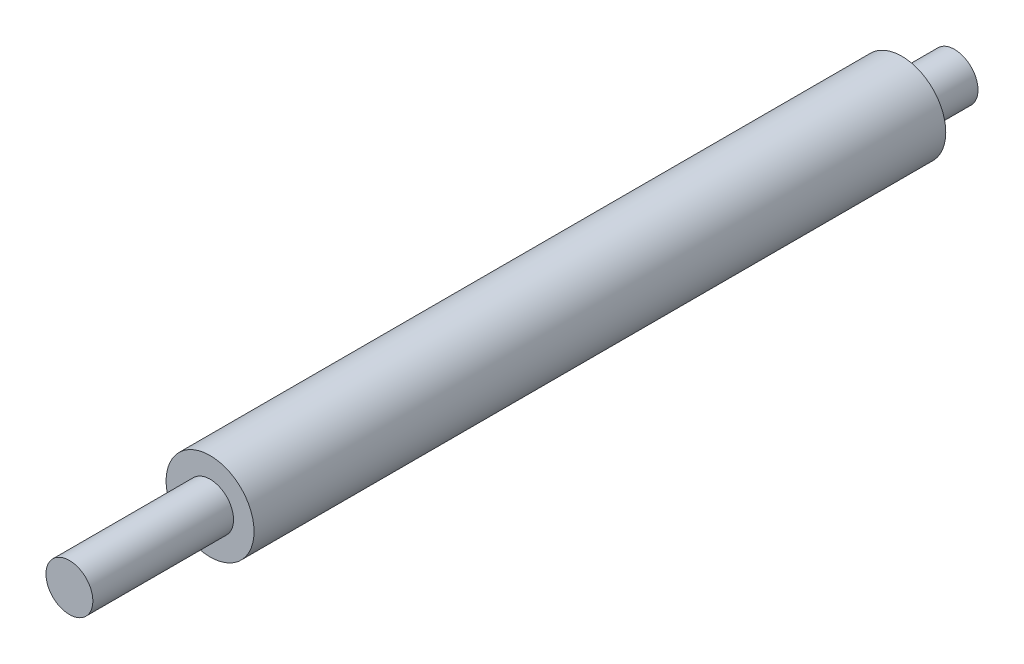
ISO-10303-21;
HEADER;
FILE_DESCRIPTION(('STEP AP214'),'2;1');
FILE_NAME('part.step','',(''),(''),'','','');
FILE_SCHEMA(('AUTOMOTIVE_DESIGN { 1 0 10303 214 1 1 1 1 }'));
ENDSEC;
DATA;
#1=APPLICATION_CONTEXT('core data for automotive mechanical design processes');
#2=APPLICATION_PROTOCOL_DEFINITION('international standard','automotive_design',2000,#1);
#3=PRODUCT_CONTEXT('',#1,'mechanical');
#4=PRODUCT('Part','Part','',(#3));
#5=PRODUCT_RELATED_PRODUCT_CATEGORY('part','',(#4));
#6=PRODUCT_DEFINITION_FORMATION('','',#4);
#7=PRODUCT_DEFINITION_CONTEXT('part definition',#1,'design');
#8=PRODUCT_DEFINITION('design','',#6,#7);
#9=PRODUCT_DEFINITION_SHAPE('','',#8);
#10=(LENGTH_UNIT() NAMED_UNIT(*) SI_UNIT(.MILLI.,.METRE.));
#11=(NAMED_UNIT(*) PLANE_ANGLE_UNIT() SI_UNIT($,.RADIAN.));
#12=(NAMED_UNIT(*) SI_UNIT($,.STERADIAN.) SOLID_ANGLE_UNIT());
#13=UNCERTAINTY_MEASURE_WITH_UNIT(LENGTH_MEASURE(1.E-05),#10,'distance_accuracy_value','');
#14=(GEOMETRIC_REPRESENTATION_CONTEXT(3) GLOBAL_UNCERTAINTY_ASSIGNED_CONTEXT((#13)) GLOBAL_UNIT_ASSIGNED_CONTEXT((#10,
#11,#12)) REPRESENTATION_CONTEXT('',''));
#15=CARTESIAN_POINT('',(0.,0.,0.));
#16=DIRECTION('',(0.,0.,1.));
#17=DIRECTION('',(1.,0.,0.));
#18=AXIS2_PLACEMENT_3D('',#15,#16,#17);
#19=CARTESIAN_POINT('',(0.,0.,295.));
#20=DIRECTION('',(0.,0.,-1.));
#21=DIRECTION('',(-1.,0.,0.));
#22=AXIS2_PLACEMENT_3D('',#19,#20,#21);
#23=CYLINDRICAL_SURFACE('',#22,37.5);
#24=CARTESIAN_POINT('',(0.,0.,295.));
#25=DIRECTION('',(0.,0.,1.));
#26=DIRECTION('',(1.,0.,0.));
#27=AXIS2_PLACEMENT_3D('',#24,#25,#26);
#28=CIRCLE('',#27,37.5);
#29=CARTESIAN_POINT('',(37.5,0.,295.));
#30=VERTEX_POINT('',#29);
#31=EDGE_CURVE('E43',#30,#30,#28,.T.);
#32=ORIENTED_EDGE('',*,*,#31,.F.);
#33=EDGE_LOOP('',(#32));
#34=FACE_BOUND('',#33,.T.);
#35=CARTESIAN_POINT('',(0.,0.,-295.));
#36=DIRECTION('',(0.,0.,1.));
#37=DIRECTION('',(1.,0.,0.));
#38=AXIS2_PLACEMENT_3D('',#35,#36,#37);
#39=CIRCLE('',#38,37.5);
#40=CARTESIAN_POINT('',(37.5,0.,-295.));
#41=VERTEX_POINT('',#40);
#42=EDGE_CURVE('E34',#41,#41,#39,.T.);
#43=ORIENTED_EDGE('',*,*,#42,.T.);
#44=EDGE_LOOP('',(#43));
#45=FACE_BOUND('',#44,.T.);
#46=ADVANCED_FACE('F31',(#34,#45),#23,.T.);
#47=CARTESIAN_POINT('',(0.,0.,295.));
#48=DIRECTION('',(0.,0.,1.));
#49=DIRECTION('',(1.,0.,0.));
#50=AXIS2_PLACEMENT_3D('',#47,#48,#49);
#51=PLANE('',#50);
#52=CARTESIAN_POINT('',(0.,0.,295.));
#53=DIRECTION('',(0.,0.,1.));
#54=DIRECTION('',(1.,0.,0.));
#55=AXIS2_PLACEMENT_3D('',#52,#53,#54);
#56=CIRCLE('',#55,20.);
#57=CARTESIAN_POINT('',(20.,0.,295.));
#58=VERTEX_POINT('',#57);
#59=EDGE_CURVE('E38',#58,#58,#56,.T.);
#60=ORIENTED_EDGE('',*,*,#59,.F.);
#61=EDGE_LOOP('',(#60));
#62=FACE_BOUND('',#61,.T.);
#63=ORIENTED_EDGE('',*,*,#31,.T.);
#64=EDGE_LOOP('',(#63));
#65=FACE_BOUND('',#64,.T.);
#66=ADVANCED_FACE('F60',(#62,#65),#51,.T.);
#67=CARTESIAN_POINT('',(0.,0.,-295.));
#68=DIRECTION('',(0.,0.,1.));
#69=DIRECTION('',(1.,0.,0.));
#70=AXIS2_PLACEMENT_3D('',#67,#68,#69);
#71=PLANE('',#70);
#72=CARTESIAN_POINT('',(0.,0.,-295.));
#73=DIRECTION('',(0.,0.,-1.));
#74=DIRECTION('',(-1.,0.,0.));
#75=AXIS2_PLACEMENT_3D('',#72,#73,#74);
#76=CIRCLE('',#75,20.);
#77=CARTESIAN_POINT('',(20.,0.,-295.));
#78=VERTEX_POINT('',#77);
#79=EDGE_CURVE('E10',#78,#78,#76,.T.);
#80=ORIENTED_EDGE('',*,*,#79,.F.);
#81=EDGE_LOOP('',(#80));
#82=FACE_BOUND('',#81,.T.);
#83=ORIENTED_EDGE('',*,*,#42,.F.);
#84=EDGE_LOOP('',(#83));
#85=FACE_BOUND('',#84,.T.);
#86=ADVANCED_FACE('F57',(#82,#85),#71,.F.);
#87=CARTESIAN_POINT('',(0.,0.,415.));
#88=DIRECTION('',(0.,0.,-1.));
#89=DIRECTION('',(-1.,0.,0.));
#90=AXIS2_PLACEMENT_3D('',#87,#88,#89);
#91=CYLINDRICAL_SURFACE('',#90,20.);
#92=CARTESIAN_POINT('',(0.,0.,415.));
#93=DIRECTION('',(0.,0.,1.));
#94=DIRECTION('',(1.,0.,0.));
#95=AXIS2_PLACEMENT_3D('',#92,#93,#94);
#96=CIRCLE('',#95,20.);
#97=CARTESIAN_POINT('',(20.,0.,415.));
#98=VERTEX_POINT('',#97);
#99=EDGE_CURVE('E48',#98,#98,#96,.T.);
#100=ORIENTED_EDGE('',*,*,#99,.F.);
#101=EDGE_LOOP('',(#100));
#102=FACE_BOUND('',#101,.T.);
#103=ORIENTED_EDGE('',*,*,#59,.T.);
#104=EDGE_LOOP('',(#103));
#105=FACE_BOUND('',#104,.T.);
#106=ADVANCED_FACE('F59',(#102,#105),#91,.T.);
#107=CARTESIAN_POINT('',(0.,0.,415.));
#108=DIRECTION('',(0.,0.,1.));
#109=DIRECTION('',(1.,0.,0.));
#110=AXIS2_PLACEMENT_3D('',#107,#108,#109);
#111=PLANE('',#110);
#112=ORIENTED_EDGE('',*,*,#99,.T.);
#113=EDGE_LOOP('',(#112));
#114=FACE_BOUND('',#113,.T.);
#115=ADVANCED_FACE('F66',(#114),#111,.T.);
#116=CARTESIAN_POINT('',(0.,0.,-340.));
#117=DIRECTION('',(0.,0.,1.));
#118=DIRECTION('',(1.,0.,0.));
#119=AXIS2_PLACEMENT_3D('',#116,#117,#118);
#120=CYLINDRICAL_SURFACE('',#119,20.);
#121=CARTESIAN_POINT('',(0.,0.,-340.));
#122=DIRECTION('',(0.,0.,-1.));
#123=DIRECTION('',(-1.,0.,0.));
#124=AXIS2_PLACEMENT_3D('',#121,#122,#123);
#125=CIRCLE('',#124,20.);
#126=CARTESIAN_POINT('',(20.,0.,-340.));
#127=VERTEX_POINT('',#126);
#128=EDGE_CURVE('E47',#127,#127,#125,.T.);
#129=CARTESIAN_POINT('',(20.,0.,-340.));
#130=CARTESIAN_POINT('',(20.,0.,-339.53125));
#131=CARTESIAN_POINT('',(20.,0.,-339.0625));
#132=CARTESIAN_POINT('',(20.,0.,-338.125));
#133=CARTESIAN_POINT('',(20.,0.,-337.65625));
#134=CARTESIAN_POINT('',(20.,0.,-336.71875));
#135=CARTESIAN_POINT('',(20.,0.,-336.25));
#136=CARTESIAN_POINT('',(20.,0.,-335.3125));
#137=CARTESIAN_POINT('',(20.,0.,-334.84375));
#138=CARTESIAN_POINT('',(20.,0.,-333.90625));
#139=CARTESIAN_POINT('',(20.,0.,-333.4375));
#140=CARTESIAN_POINT('',(20.,0.,-332.5));
#141=CARTESIAN_POINT('',(20.,0.,-332.03125));
#142=CARTESIAN_POINT('',(20.,0.,-331.09375));
#143=CARTESIAN_POINT('',(20.,0.,-330.625));
#144=CARTESIAN_POINT('',(20.,0.,-329.6875));
#145=CARTESIAN_POINT('',(20.,0.,-329.21875));
#146=CARTESIAN_POINT('',(20.,0.,-328.28125));
#147=CARTESIAN_POINT('',(20.,0.,-327.8125));
#148=CARTESIAN_POINT('',(20.,0.,-326.875));
#149=CARTESIAN_POINT('',(20.,0.,-326.40625));
#150=CARTESIAN_POINT('',(20.,0.,-325.46875));
#151=CARTESIAN_POINT('',(20.,0.,-325.));
#152=CARTESIAN_POINT('',(20.,0.,-324.0625));
#153=CARTESIAN_POINT('',(20.,0.,-323.59375));
#154=CARTESIAN_POINT('',(20.,0.,-322.65625));
#155=CARTESIAN_POINT('',(20.,0.,-322.1875));
#156=CARTESIAN_POINT('',(20.,0.,-321.25));
#157=CARTESIAN_POINT('',(20.,0.,-320.78125));
#158=CARTESIAN_POINT('',(20.,0.,-319.84375));
#159=CARTESIAN_POINT('',(20.,0.,-319.375));
#160=CARTESIAN_POINT('',(20.,0.,-318.4375));
#161=CARTESIAN_POINT('',(20.,0.,-317.96875));
#162=CARTESIAN_POINT('',(20.,0.,-317.03125));
#163=CARTESIAN_POINT('',(20.,0.,-316.5625));
#164=CARTESIAN_POINT('',(20.,0.,-315.625));
#165=CARTESIAN_POINT('',(20.,0.,-315.15625));
#166=CARTESIAN_POINT('',(20.,0.,-314.21875));
#167=CARTESIAN_POINT('',(20.,0.,-313.75));
#168=CARTESIAN_POINT('',(20.,0.,-312.8125));
#169=CARTESIAN_POINT('',(20.,0.,-312.34375));
#170=CARTESIAN_POINT('',(20.,0.,-311.40625));
#171=CARTESIAN_POINT('',(20.,0.,-310.9375));
#172=CARTESIAN_POINT('',(20.,0.,-310.));
#173=CARTESIAN_POINT('',(20.,0.,-309.53125));
#174=CARTESIAN_POINT('',(20.,0.,-308.59375));
#175=CARTESIAN_POINT('',(20.,0.,-308.125));
#176=CARTESIAN_POINT('',(20.,0.,-307.1875));
#177=CARTESIAN_POINT('',(20.,0.,-306.71875));
#178=CARTESIAN_POINT('',(20.,0.,-305.78125));
#179=CARTESIAN_POINT('',(20.,0.,-305.3125));
#180=CARTESIAN_POINT('',(20.,0.,-304.375));
#181=CARTESIAN_POINT('',(20.,0.,-303.90625));
#182=CARTESIAN_POINT('',(20.,0.,-302.96875));
#183=CARTESIAN_POINT('',(20.,0.,-302.5));
#184=CARTESIAN_POINT('',(20.,0.,-301.5625));
#185=CARTESIAN_POINT('',(20.,0.,-301.09375));
#186=CARTESIAN_POINT('',(20.,0.,-300.15625));
#187=CARTESIAN_POINT('',(20.,0.,-299.6875));
#188=CARTESIAN_POINT('',(20.,0.,-298.75));
#189=CARTESIAN_POINT('',(20.,0.,-298.28125));
#190=CARTESIAN_POINT('',(20.,0.,-297.34375));
#191=CARTESIAN_POINT('',(20.,0.,-296.875));
#192=CARTESIAN_POINT('',(20.,0.,-295.9375));
#193=CARTESIAN_POINT('',(20.,0.,-295.46875));
#194=CARTESIAN_POINT('',(20.,0.,-295.));
#195=B_SPLINE_CURVE_WITH_KNOTS('',3,(#129,#130,#131,#132,#133,#134,#135,#136,#137,#138,#139,
#140,#141,#142,#143,#144,#145,#146,#147,#148,#149,#150,#151,#152,#153,#154,#155,#156,#157,#158,
#159,#160,#161,#162,#163,#164,#165,#166,#167,#168,#169,#170,#171,#172,#173,#174,#175,#176,#177,
#178,#179,#180,#181,#182,#183,#184,#185,#186,#187,#188,#189,#190,#191,#192,#193,#194),
.UNSPECIFIED.,.F.,.F.,(4,2,2,2,2,2,2,2,2,2,2,2,2,2,2,2,2,2,2,2,2,2,2,2,2,2,2,2,2,2,2,2,4),(0.,
1.40625,2.8125,4.21874999999999,5.62499999999999,7.03124999999999,8.43749999999999,
9.84374999999998,11.25,12.65625,14.0625,15.46875,16.875,18.28125,19.6875,21.09375,22.5,23.90625,
25.3125,26.71875,28.125,29.53125,30.9375,32.34375,33.7499999999999,35.1562499999999,
36.5624999999999,37.9687499999999,39.3749999999999,40.7812499999999,42.1874999999999,
43.5937499999999,44.9999999999999),.UNSPECIFIED.);
#196=EDGE_CURVE('BSEAM94',#127,#78,#195,.T.);
#197=ORIENTED_EDGE('',*,*,#128,.F.);
#198=ORIENTED_EDGE('',*,*,#79,.T.);
#199=ORIENTED_EDGE('',*,*,#196,.T.);
#200=ORIENTED_EDGE('',*,*,#196,.F.);
#201=EDGE_LOOP('',(#197,#199,#198,#200));
#202=FACE_BOUND('',#201,.T.);
#203=ADVANCED_FACE('F94',(#202),#120,.T.);
#204=CARTESIAN_POINT('',(0.,0.,-340.));
#205=DIRECTION('',(0.,0.,-1.));
#206=DIRECTION('',(-1.,0.,0.));
#207=AXIS2_PLACEMENT_3D('',#204,#205,#206);
#208=PLANE('',#207);
#209=ORIENTED_EDGE('',*,*,#128,.T.);
#210=EDGE_LOOP('',(#209));
#211=FACE_BOUND('',#210,.T.);
#212=ADVANCED_FACE('F108',(#211),#208,.T.);
#213=CLOSED_SHELL('',(#46,#66,#86,#106,#115,#203,#212));
#214=MANIFOLD_SOLID_BREP('B2',#213);
#215=ADVANCED_BREP_SHAPE_REPRESENTATION('',(#18,#214),#14);
#216=SHAPE_DEFINITION_REPRESENTATION(#9,#215);
ENDSEC;
END-ISO-10303-21;
